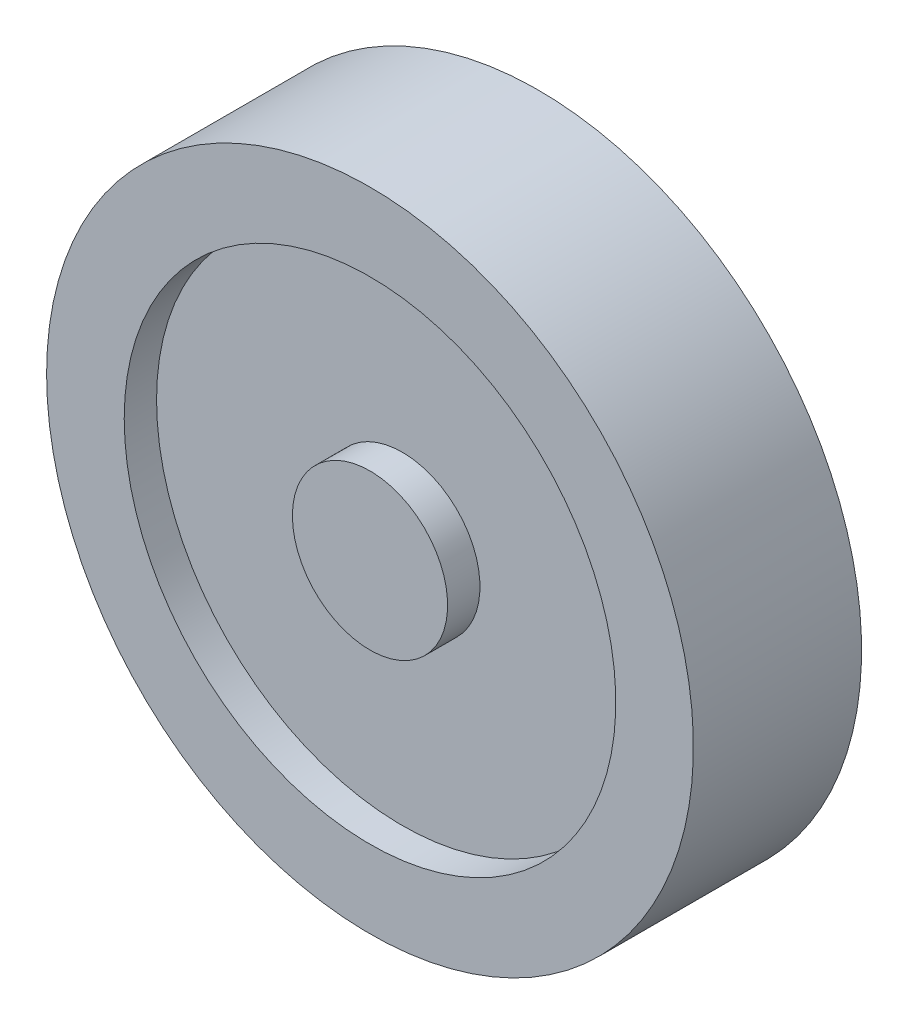
ISO-10303-21;
HEADER;
FILE_DESCRIPTION(('STEP AP214'),'2;1');
FILE_NAME('part.step','',(''),(''),'','','');
FILE_SCHEMA(('AUTOMOTIVE_DESIGN { 1 0 10303 214 1 1 1 1 }'));
ENDSEC;
DATA;
#1=APPLICATION_CONTEXT('core data for automotive mechanical design processes');
#2=APPLICATION_PROTOCOL_DEFINITION('international standard','automotive_design',2000,#1);
#3=PRODUCT_CONTEXT('',#1,'mechanical');
#4=PRODUCT('Part','Part','',(#3));
#5=PRODUCT_RELATED_PRODUCT_CATEGORY('part','',(#4));
#6=PRODUCT_DEFINITION_FORMATION('','',#4);
#7=PRODUCT_DEFINITION_CONTEXT('part definition',#1,'design');
#8=PRODUCT_DEFINITION('design','',#6,#7);
#9=PRODUCT_DEFINITION_SHAPE('','',#8);
#10=(LENGTH_UNIT() NAMED_UNIT(*) SI_UNIT(.MILLI.,.METRE.));
#11=(NAMED_UNIT(*) PLANE_ANGLE_UNIT() SI_UNIT($,.RADIAN.));
#12=(NAMED_UNIT(*) SI_UNIT($,.STERADIAN.) SOLID_ANGLE_UNIT());
#13=UNCERTAINTY_MEASURE_WITH_UNIT(LENGTH_MEASURE(1.E-05),#10,'distance_accuracy_value','');
#14=(GEOMETRIC_REPRESENTATION_CONTEXT(3) GLOBAL_UNCERTAINTY_ASSIGNED_CONTEXT((#13)) GLOBAL_UNIT_ASSIGNED_CONTEXT((#10,
#11,#12)) REPRESENTATION_CONTEXT('',''));
#15=CARTESIAN_POINT('',(0.,0.,0.));
#16=DIRECTION('',(0.,0.,1.));
#17=DIRECTION('',(1.,0.,0.));
#18=AXIS2_PLACEMENT_3D('',#15,#16,#17);
#19=CARTESIAN_POINT('',(0.,0.,-13.));
#20=DIRECTION('',(0.,0.,1.));
#21=DIRECTION('',(1.,0.,0.));
#22=AXIS2_PLACEMENT_3D('',#19,#20,#21);
#23=PLANE('',#22);
#24=CARTESIAN_POINT('',(0.,0.,-13.));
#25=DIRECTION('',(0.,0.,-1.));
#26=DIRECTION('',(-1.,0.,0.));
#27=AXIS2_PLACEMENT_3D('',#24,#25,#26);
#28=CIRCLE('',#27,12.);
#29=CARTESIAN_POINT('',(-12.,0.,-13.));
#30=VERTEX_POINT('',#29);
#31=EDGE_CURVE('E10',#30,#30,#28,.T.);
#32=ORIENTED_EDGE('',*,*,#31,.T.);
#33=EDGE_LOOP('',(#32));
#34=FACE_BOUND('',#33,.T.);
#35=ADVANCED_FACE('F40',(#34),#23,.F.);
#36=CARTESIAN_POINT('',(0.,0.,-18.));
#37=DIRECTION('',(0.,0.,-1.));
#38=DIRECTION('',(-1.,0.,0.));
#39=AXIS2_PLACEMENT_3D('',#36,#37,#38);
#40=CYLINDRICAL_SURFACE('',#39,12.);
#41=ORIENTED_EDGE('',*,*,#31,.F.);
#42=EDGE_LOOP('',(#41));
#43=FACE_BOUND('',#42,.T.);
#44=CARTESIAN_POINT('',(0.,0.,-8.));
#45=DIRECTION('',(0.,0.,-1.));
#46=DIRECTION('',(-1.,0.,0.));
#47=AXIS2_PLACEMENT_3D('',#44,#45,#46);
#48=CIRCLE('',#47,12.);
#49=CARTESIAN_POINT('',(-12.,0.,-8.));
#50=VERTEX_POINT('',#49);
#51=EDGE_CURVE('E43',#50,#50,#48,.T.);
#52=ORIENTED_EDGE('',*,*,#51,.T.);
#53=EDGE_LOOP('',(#52));
#54=FACE_BOUND('',#53,.T.);
#55=ADVANCED_FACE('F90',(#43,#54),#40,.T.);
#56=CARTESIAN_POINT('',(12.,0.,-8.));
#57=DIRECTION('',(0.,0.,1.));
#58=DIRECTION('',(1.,0.,0.));
#59=AXIS2_PLACEMENT_3D('',#56,#57,#58);
#60=PLANE('',#59);
#61=ORIENTED_EDGE('',*,*,#51,.F.);
#62=EDGE_LOOP('',(#61));
#63=FACE_BOUND('',#62,.T.);
#64=CARTESIAN_POINT('',(0.,0.,-8.));
#65=DIRECTION('',(0.,0.,-1.));
#66=DIRECTION('',(-1.,0.,0.));
#67=AXIS2_PLACEMENT_3D('',#64,#65,#66);
#68=CIRCLE('',#67,38.);
#69=CARTESIAN_POINT('',(-38.,0.,-8.));
#70=VERTEX_POINT('',#69);
#71=EDGE_CURVE('E50',#70,#70,#68,.T.);
#72=ORIENTED_EDGE('',*,*,#71,.T.);
#73=EDGE_LOOP('',(#72));
#74=FACE_BOUND('',#73,.T.);
#75=ADVANCED_FACE('F91',(#63,#74),#60,.F.);
#76=CARTESIAN_POINT('',(0.,0.,-18.));
#77=DIRECTION('',(0.,0.,-1.));
#78=DIRECTION('',(-1.,0.,0.));
#79=AXIS2_PLACEMENT_3D('',#76,#77,#78);
#80=CYLINDRICAL_SURFACE('',#79,38.);
#81=ORIENTED_EDGE('',*,*,#71,.F.);
#82=EDGE_LOOP('',(#81));
#83=FACE_BOUND('',#82,.T.);
#84=CARTESIAN_POINT('',(0.,0.,-13.));
#85=DIRECTION('',(0.,0.,-1.));
#86=DIRECTION('',(-1.,0.,0.));
#87=AXIS2_PLACEMENT_3D('',#84,#85,#86);
#88=CIRCLE('',#87,38.);
#89=CARTESIAN_POINT('',(-38.,0.,-13.));
#90=VERTEX_POINT('',#89);
#91=EDGE_CURVE('E51',#90,#90,#88,.T.);
#92=ORIENTED_EDGE('',*,*,#91,.T.);
#93=EDGE_LOOP('',(#92));
#94=FACE_BOUND('',#93,.T.);
#95=ADVANCED_FACE('F96',(#83,#94),#80,.F.);
#96=CARTESIAN_POINT('',(38.,0.,-13.));
#97=DIRECTION('',(0.,0.,1.));
#98=DIRECTION('',(1.,0.,0.));
#99=AXIS2_PLACEMENT_3D('',#96,#97,#98);
#100=PLANE('',#99);
#101=ORIENTED_EDGE('',*,*,#91,.F.);
#102=EDGE_LOOP('',(#101));
#103=FACE_BOUND('',#102,.T.);
#104=CARTESIAN_POINT('',(0.,0.,-13.));
#105=DIRECTION('',(0.,0.,-1.));
#106=DIRECTION('',(-1.,0.,0.));
#107=AXIS2_PLACEMENT_3D('',#104,#105,#106);
#108=CIRCLE('',#107,50.);
#109=CARTESIAN_POINT('',(-50.,0.,-13.));
#110=VERTEX_POINT('',#109);
#111=EDGE_CURVE('E57',#110,#110,#108,.T.);
#112=ORIENTED_EDGE('',*,*,#111,.T.);
#113=EDGE_LOOP('',(#112));
#114=FACE_BOUND('',#113,.T.);
#115=ADVANCED_FACE('F105',(#103,#114),#100,.F.);
#116=CARTESIAN_POINT('',(0.,0.,-18.));
#117=DIRECTION('',(0.,0.,-1.));
#118=DIRECTION('',(-1.,0.,0.));
#119=AXIS2_PLACEMENT_3D('',#116,#117,#118);
#120=CYLINDRICAL_SURFACE('',#119,50.);
#121=ORIENTED_EDGE('',*,*,#111,.F.);
#122=EDGE_LOOP('',(#121));
#123=FACE_BOUND('',#122,.T.);
#124=CARTESIAN_POINT('',(0.,0.,13.));
#125=DIRECTION('',(0.,0.,-1.));
#126=DIRECTION('',(-1.,0.,0.));
#127=AXIS2_PLACEMENT_3D('',#124,#125,#126);
#128=CIRCLE('',#127,50.);
#129=CARTESIAN_POINT('',(-50.,0.,13.));
#130=VERTEX_POINT('',#129);
#131=EDGE_CURVE('E56',#130,#130,#128,.T.);
#132=ORIENTED_EDGE('',*,*,#131,.T.);
#133=EDGE_LOOP('',(#132));
#134=FACE_BOUND('',#133,.T.);
#135=ADVANCED_FACE('F107',(#123,#134),#120,.T.);
#136=CARTESIAN_POINT('',(50.,0.,13.));
#137=DIRECTION('',(0.,0.,-1.));
#138=DIRECTION('',(-1.,0.,0.));
#139=AXIS2_PLACEMENT_3D('',#136,#137,#138);
#140=PLANE('',#139);
#141=ORIENTED_EDGE('',*,*,#131,.F.);
#142=EDGE_LOOP('',(#141));
#143=FACE_BOUND('',#142,.T.);
#144=CARTESIAN_POINT('',(0.,0.,13.));
#145=DIRECTION('',(0.,0.,-1.));
#146=DIRECTION('',(-1.,0.,0.));
#147=AXIS2_PLACEMENT_3D('',#144,#145,#146);
#148=CIRCLE('',#147,38.);
#149=CARTESIAN_POINT('',(-38.,0.,13.));
#150=VERTEX_POINT('',#149);
#151=EDGE_CURVE('E64',#150,#150,#148,.T.);
#152=ORIENTED_EDGE('',*,*,#151,.T.);
#153=EDGE_LOOP('',(#152));
#154=FACE_BOUND('',#153,.T.);
#155=ADVANCED_FACE('F108',(#143,#154),#140,.F.);
#156=CARTESIAN_POINT('',(0.,0.,-18.));
#157=DIRECTION('',(0.,0.,-1.));
#158=DIRECTION('',(-1.,0.,0.));
#159=AXIS2_PLACEMENT_3D('',#156,#157,#158);
#160=CYLINDRICAL_SURFACE('',#159,38.);
#161=ORIENTED_EDGE('',*,*,#151,.F.);
#162=EDGE_LOOP('',(#161));
#163=FACE_BOUND('',#162,.T.);
#164=CARTESIAN_POINT('',(0.,0.,8.));
#165=DIRECTION('',(0.,0.,-1.));
#166=DIRECTION('',(-1.,0.,0.));
#167=AXIS2_PLACEMENT_3D('',#164,#165,#166);
#168=CIRCLE('',#167,38.);
#169=CARTESIAN_POINT('',(-38.,0.,8.));
#170=VERTEX_POINT('',#169);
#171=EDGE_CURVE('E63',#170,#170,#168,.T.);
#172=ORIENTED_EDGE('',*,*,#171,.T.);
#173=EDGE_LOOP('',(#172));
#174=FACE_BOUND('',#173,.T.);
#175=ADVANCED_FACE('F114',(#163,#174),#160,.F.);
#176=CARTESIAN_POINT('',(38.,0.,8.));
#177=DIRECTION('',(0.,0.,-1.));
#178=DIRECTION('',(-1.,0.,0.));
#179=AXIS2_PLACEMENT_3D('',#176,#177,#178);
#180=PLANE('',#179);
#181=ORIENTED_EDGE('',*,*,#171,.F.);
#182=EDGE_LOOP('',(#181));
#183=FACE_BOUND('',#182,.T.);
#184=CARTESIAN_POINT('',(0.,0.,8.));
#185=DIRECTION('',(0.,0.,-1.));
#186=DIRECTION('',(-1.,0.,0.));
#187=AXIS2_PLACEMENT_3D('',#184,#185,#186);
#188=CIRCLE('',#187,12.);
#189=CARTESIAN_POINT('',(-12.,0.,8.));
#190=VERTEX_POINT('',#189);
#191=EDGE_CURVE('E66',#190,#190,#188,.T.);
#192=ORIENTED_EDGE('',*,*,#191,.T.);
#193=EDGE_LOOP('',(#192));
#194=FACE_BOUND('',#193,.T.);
#195=ADVANCED_FACE('F81',(#183,#194),#180,.F.);
#196=CARTESIAN_POINT('',(0.,0.,-18.));
#197=DIRECTION('',(0.,0.,-1.));
#198=DIRECTION('',(-1.,0.,0.));
#199=AXIS2_PLACEMENT_3D('',#196,#197,#198);
#200=CYLINDRICAL_SURFACE('',#199,12.);
#201=ORIENTED_EDGE('',*,*,#191,.F.);
#202=EDGE_LOOP('',(#201));
#203=FACE_BOUND('',#202,.T.);
#204=CARTESIAN_POINT('',(0.,0.,13.));
#205=DIRECTION('',(0.,0.,-1.));
#206=DIRECTION('',(-1.,0.,0.));
#207=AXIS2_PLACEMENT_3D('',#204,#205,#206);
#208=CIRCLE('',#207,12.);
#209=CARTESIAN_POINT('',(-12.,0.,13.));
#210=VERTEX_POINT('',#209);
#211=EDGE_CURVE('E72',#210,#210,#208,.T.);
#212=ORIENTED_EDGE('',*,*,#211,.T.);
#213=EDGE_LOOP('',(#212));
#214=FACE_BOUND('',#213,.T.);
#215=ADVANCED_FACE('F73',(#203,#214),#200,.T.);
#216=CARTESIAN_POINT('',(12.,0.,13.));
#217=DIRECTION('',(0.,0.,-1.));
#218=DIRECTION('',(-1.,0.,0.));
#219=AXIS2_PLACEMENT_3D('',#216,#217,#218);
#220=PLANE('',#219);
#221=ORIENTED_EDGE('',*,*,#211,.F.);
#222=EDGE_LOOP('',(#221));
#223=FACE_BOUND('',#222,.T.);
#224=ADVANCED_FACE('F77',(#223),#220,.F.);
#225=CLOSED_SHELL('',(#35,#55,#75,#95,#115,#135,#155,#175,#195,#215,#224));
#226=MANIFOLD_SOLID_BREP('B2',#225);
#227=ADVANCED_BREP_SHAPE_REPRESENTATION('',(#18,#226),#14);
#228=SHAPE_DEFINITION_REPRESENTATION(#9,#227);
ENDSEC;
END-ISO-10303-21;
